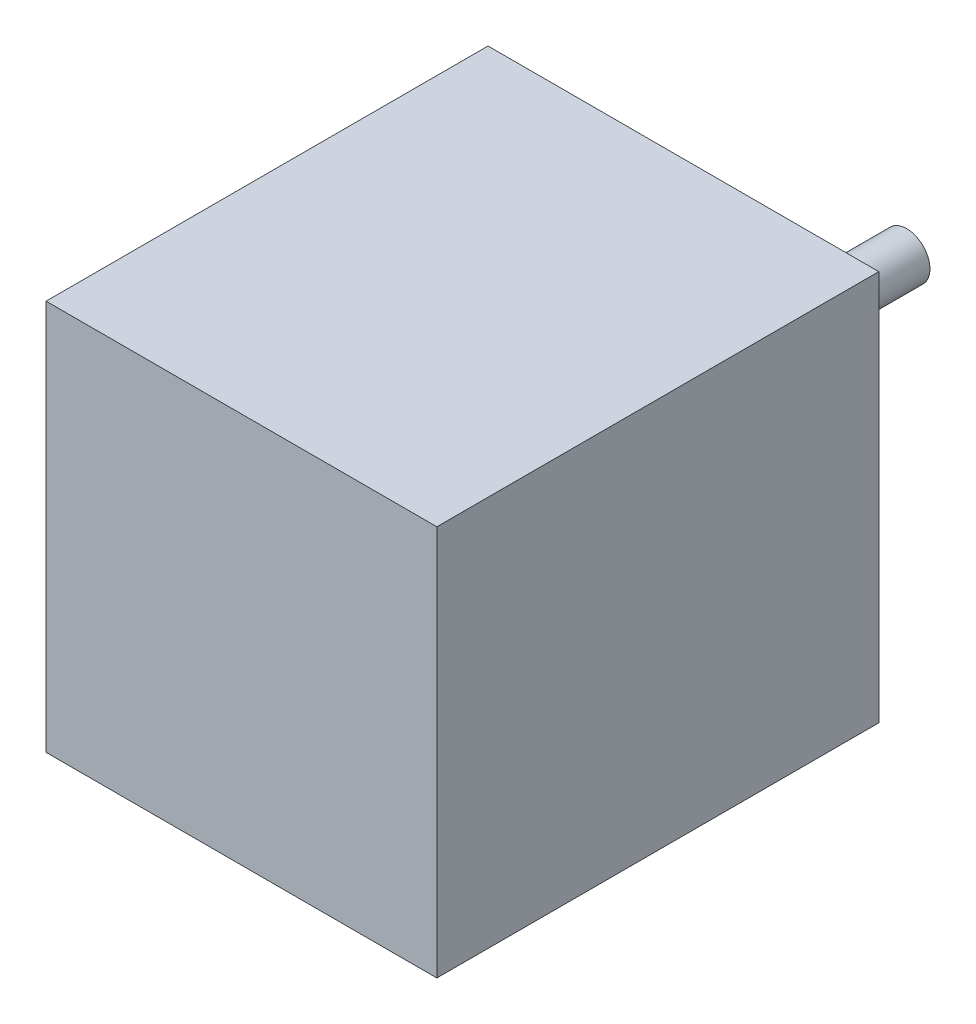
ISO-10303-21;
HEADER;
FILE_DESCRIPTION(('STEP AP214'),'2;1');
FILE_NAME('part.step','',(''),(''),'','','');
FILE_SCHEMA(('AUTOMOTIVE_DESIGN { 1 0 10303 214 1 1 1 1 }'));
ENDSEC;
DATA;
#1=APPLICATION_CONTEXT('core data for automotive mechanical design processes');
#2=APPLICATION_PROTOCOL_DEFINITION('international standard','automotive_design',2000,#1);
#3=PRODUCT_CONTEXT('',#1,'mechanical');
#4=PRODUCT('Part','Part','',(#3));
#5=PRODUCT_RELATED_PRODUCT_CATEGORY('part','',(#4));
#6=PRODUCT_DEFINITION_FORMATION('','',#4);
#7=PRODUCT_DEFINITION_CONTEXT('part definition',#1,'design');
#8=PRODUCT_DEFINITION('design','',#6,#7);
#9=PRODUCT_DEFINITION_SHAPE('','',#8);
#10=(LENGTH_UNIT() NAMED_UNIT(*) SI_UNIT(.MILLI.,.METRE.));
#11=(NAMED_UNIT(*) PLANE_ANGLE_UNIT() SI_UNIT($,.RADIAN.));
#12=(NAMED_UNIT(*) SI_UNIT($,.STERADIAN.) SOLID_ANGLE_UNIT());
#13=UNCERTAINTY_MEASURE_WITH_UNIT(LENGTH_MEASURE(1.E-05),#10,'distance_accuracy_value','');
#14=(GEOMETRIC_REPRESENTATION_CONTEXT(3) GLOBAL_UNCERTAINTY_ASSIGNED_CONTEXT((#13)) GLOBAL_UNIT_ASSIGNED_CONTEXT((#10,
#11,#12)) REPRESENTATION_CONTEXT('',''));
#15=CARTESIAN_POINT('',(0.,0.,0.));
#16=DIRECTION('',(0.,0.,1.));
#17=DIRECTION('',(1.,0.,0.));
#18=AXIS2_PLACEMENT_3D('',#15,#16,#17);
#19=CARTESIAN_POINT('',(0.,0.,47.5));
#20=DIRECTION('',(-1.,0.,0.));
#21=DIRECTION('',(0.,0.,1.));
#22=AXIS2_PLACEMENT_3D('',#19,#20,#21);
#23=PLANE('',#22);
#24=DIRECTION('',(0.,1.,0.));
#25=VECTOR('',#24,1.);
#26=CARTESIAN_POINT('',(0.,0.,0.));
#27=LINE('',#26,#25);
#28=CARTESIAN_POINT('',(0.,0.,0.));
#29=VERTEX_POINT('',#28);
#30=CARTESIAN_POINT('',(0.,42.,0.));
#31=VERTEX_POINT('',#30);
#32=EDGE_CURVE('E101',#29,#31,#27,.T.);
#33=ORIENTED_EDGE('',*,*,#32,.T.);
#34=DIRECTION('',(0.,0.,-1.));
#35=VECTOR('',#34,1.);
#36=CARTESIAN_POINT('',(0.,42.,47.5));
#37=LINE('',#36,#35);
#38=CARTESIAN_POINT('',(0.,42.,47.5));
#39=VERTEX_POINT('',#38);
#40=EDGE_CURVE('E37',#39,#31,#37,.T.);
#41=ORIENTED_EDGE('',*,*,#40,.F.);
#42=DIRECTION('',(0.,1.,0.));
#43=VECTOR('',#42,1.);
#44=CARTESIAN_POINT('',(0.,0.,47.5));
#45=LINE('',#44,#43);
#46=CARTESIAN_POINT('',(0.,0.,47.5));
#47=VERTEX_POINT('',#46);
#48=EDGE_CURVE('E88',#47,#39,#45,.T.);
#49=ORIENTED_EDGE('',*,*,#48,.F.);
#50=DIRECTION('',(0.,0.,-1.));
#51=VECTOR('',#50,1.);
#52=CARTESIAN_POINT('',(0.,0.,47.5));
#53=LINE('',#52,#51);
#54=EDGE_CURVE('E97',#47,#29,#53,.T.);
#55=ORIENTED_EDGE('',*,*,#54,.T.);
#56=EDGE_LOOP('',(#33,#41,#49,#55));
#57=FACE_BOUND('',#56,.T.);
#58=ADVANCED_FACE('F34',(#57),#23,.F.);
#59=CARTESIAN_POINT('',(0.,42.,47.5));
#60=DIRECTION('',(0.,-1.,0.));
#61=DIRECTION('',(1.,0.,0.));
#62=AXIS2_PLACEMENT_3D('',#59,#60,#61);
#63=PLANE('',#62);
#64=DIRECTION('',(-1.,0.,0.));
#65=VECTOR('',#64,1.);
#66=CARTESIAN_POINT('',(0.,42.,0.));
#67=LINE('',#66,#65);
#68=CARTESIAN_POINT('',(-42.,42.,0.));
#69=VERTEX_POINT('',#68);
#70=EDGE_CURVE('E93',#31,#69,#67,.T.);
#71=ORIENTED_EDGE('',*,*,#70,.T.);
#72=DIRECTION('',(0.,0.,-1.));
#73=VECTOR('',#72,1.);
#74=CARTESIAN_POINT('',(-42.,42.,47.5));
#75=LINE('',#74,#73);
#76=CARTESIAN_POINT('',(-42.,42.,47.5));
#77=VERTEX_POINT('',#76);
#78=EDGE_CURVE('E91',#77,#69,#75,.T.);
#79=ORIENTED_EDGE('',*,*,#78,.F.);
#80=DIRECTION('',(-1.,0.,0.));
#81=VECTOR('',#80,1.);
#82=CARTESIAN_POINT('',(0.,42.,47.5));
#83=LINE('',#82,#81);
#84=EDGE_CURVE('E83',#39,#77,#83,.T.);
#85=ORIENTED_EDGE('',*,*,#84,.F.);
#86=ORIENTED_EDGE('',*,*,#40,.T.);
#87=EDGE_LOOP('',(#71,#79,#85,#86));
#88=FACE_BOUND('',#87,.T.);
#89=ADVANCED_FACE('F92',(#88),#63,.F.);
#90=CARTESIAN_POINT('',(-42.,0.,47.5));
#91=DIRECTION('',(1.,0.,0.));
#92=DIRECTION('',(0.,0.,-1.));
#93=AXIS2_PLACEMENT_3D('',#90,#91,#92);
#94=PLANE('',#93);
#95=DIRECTION('',(0.,-1.,0.));
#96=VECTOR('',#95,1.);
#97=CARTESIAN_POINT('',(-42.,0.,0.));
#98=LINE('',#97,#96);
#99=CARTESIAN_POINT('',(-42.,0.,0.));
#100=VERTEX_POINT('',#99);
#101=EDGE_CURVE('E69',#69,#100,#98,.T.);
#102=ORIENTED_EDGE('',*,*,#101,.T.);
#103=DIRECTION('',(0.,0.,-1.));
#104=VECTOR('',#103,1.);
#105=CARTESIAN_POINT('',(-42.,0.,47.5));
#106=LINE('',#105,#104);
#107=CARTESIAN_POINT('',(-42.,0.,47.5));
#108=VERTEX_POINT('',#107);
#109=EDGE_CURVE('E94',#108,#100,#106,.T.);
#110=ORIENTED_EDGE('',*,*,#109,.F.);
#111=DIRECTION('',(0.,-1.,0.));
#112=VECTOR('',#111,1.);
#113=CARTESIAN_POINT('',(-42.,0.,47.5));
#114=LINE('',#113,#112);
#115=EDGE_CURVE('E86',#77,#108,#114,.T.);
#116=ORIENTED_EDGE('',*,*,#115,.F.);
#117=ORIENTED_EDGE('',*,*,#78,.T.);
#118=EDGE_LOOP('',(#102,#110,#116,#117));
#119=FACE_BOUND('',#118,.T.);
#120=ADVANCED_FACE('F95',(#119),#94,.F.);
#121=CARTESIAN_POINT('',(0.,0.,47.5));
#122=DIRECTION('',(0.,1.,0.));
#123=DIRECTION('',(-1.,0.,0.));
#124=AXIS2_PLACEMENT_3D('',#121,#122,#123);
#125=PLANE('',#124);
#126=DIRECTION('',(1.,0.,0.));
#127=VECTOR('',#126,1.);
#128=CARTESIAN_POINT('',(0.,0.,0.));
#129=LINE('',#128,#127);
#130=EDGE_CURVE('E75',#100,#29,#129,.T.);
#131=ORIENTED_EDGE('',*,*,#130,.T.);
#132=ORIENTED_EDGE('',*,*,#54,.F.);
#133=DIRECTION('',(1.,0.,0.));
#134=VECTOR('',#133,1.);
#135=CARTESIAN_POINT('',(0.,0.,47.5));
#136=LINE('',#135,#134);
#137=EDGE_CURVE('E52',#108,#47,#136,.T.);
#138=ORIENTED_EDGE('',*,*,#137,.F.);
#139=ORIENTED_EDGE('',*,*,#109,.T.);
#140=EDGE_LOOP('',(#131,#132,#138,#139));
#141=FACE_BOUND('',#140,.T.);
#142=ADVANCED_FACE('F109',(#141),#125,.F.);
#143=CARTESIAN_POINT('',(0.,0.,47.5));
#144=DIRECTION('',(0.,0.,1.));
#145=DIRECTION('',(1.,0.,0.));
#146=AXIS2_PLACEMENT_3D('',#143,#144,#145);
#147=PLANE('',#146);
#148=ORIENTED_EDGE('',*,*,#48,.T.);
#149=ORIENTED_EDGE('',*,*,#84,.T.);
#150=ORIENTED_EDGE('',*,*,#115,.T.);
#151=ORIENTED_EDGE('',*,*,#137,.T.);
#152=EDGE_LOOP('',(#148,#149,#150,#151));
#153=FACE_BOUND('',#152,.T.);
#154=ADVANCED_FACE('F84',(#153),#147,.T.);
#155=CARTESIAN_POINT('',(0.,0.,0.));
#156=DIRECTION('',(0.,0.,1.));
#157=DIRECTION('',(1.,0.,0.));
#158=AXIS2_PLACEMENT_3D('',#155,#156,#157);
#159=PLANE('',#158);
#160=CARTESIAN_POINT('',(-5.5,36.5,0.));
#161=DIRECTION('',(0.,0.,-1.));
#162=DIRECTION('',(-1.,0.,0.));
#163=AXIS2_PLACEMENT_3D('',#160,#161,#162);
#164=CIRCLE('',#163,1.5);
#165=CARTESIAN_POINT('',(-7.,36.5,0.));
#166=VERTEX_POINT('',#165);
#167=EDGE_CURVE('E129',#166,#166,#164,.T.);
#168=ORIENTED_EDGE('',*,*,#167,.F.);
#169=EDGE_LOOP('',(#168));
#170=FACE_BOUND('',#169,.T.);
#171=CARTESIAN_POINT('',(-36.5,36.5,0.));
#172=DIRECTION('',(0.,0.,-1.));
#173=DIRECTION('',(-1.,0.,0.));
#174=AXIS2_PLACEMENT_3D('',#171,#172,#173);
#175=CIRCLE('',#174,1.5);
#176=CARTESIAN_POINT('',(-38.,36.5,0.));
#177=VERTEX_POINT('',#176);
#178=EDGE_CURVE('E135',#177,#177,#175,.T.);
#179=ORIENTED_EDGE('',*,*,#178,.F.);
#180=EDGE_LOOP('',(#179));
#181=FACE_BOUND('',#180,.T.);
#182=CARTESIAN_POINT('',(-36.5,5.5,0.));
#183=DIRECTION('',(0.,0.,-1.));
#184=DIRECTION('',(-1.,0.,0.));
#185=AXIS2_PLACEMENT_3D('',#182,#183,#184);
#186=CIRCLE('',#185,1.5);
#187=CARTESIAN_POINT('',(-38.,5.5,0.));
#188=VERTEX_POINT('',#187);
#189=EDGE_CURVE('E141',#188,#188,#186,.T.);
#190=ORIENTED_EDGE('',*,*,#189,.F.);
#191=EDGE_LOOP('',(#190));
#192=FACE_BOUND('',#191,.T.);
#193=CARTESIAN_POINT('',(-5.5,5.5,0.));
#194=DIRECTION('',(0.,0.,-1.));
#195=DIRECTION('',(-1.,0.,0.));
#196=AXIS2_PLACEMENT_3D('',#193,#194,#195);
#197=CIRCLE('',#196,1.5);
#198=CARTESIAN_POINT('',(-7.,5.5,0.));
#199=VERTEX_POINT('',#198);
#200=EDGE_CURVE('E123',#199,#199,#197,.T.);
#201=ORIENTED_EDGE('',*,*,#200,.F.);
#202=EDGE_LOOP('',(#201));
#203=FACE_BOUND('',#202,.T.);
#204=CARTESIAN_POINT('',(-21.,21.,0.));
#205=DIRECTION('',(0.,0.,-1.));
#206=DIRECTION('',(-1.,0.,0.));
#207=AXIS2_PLACEMENT_3D('',#204,#205,#206);
#208=CIRCLE('',#207,11.);
#209=CARTESIAN_POINT('',(-32.,21.,0.));
#210=VERTEX_POINT('',#209);
#211=EDGE_CURVE('E43',#210,#210,#208,.T.);
#212=ORIENTED_EDGE('',*,*,#211,.F.);
#213=EDGE_LOOP('',(#212));
#214=FACE_BOUND('',#213,.T.);
#215=ORIENTED_EDGE('',*,*,#32,.F.);
#216=ORIENTED_EDGE('',*,*,#130,.F.);
#217=ORIENTED_EDGE('',*,*,#101,.F.);
#218=ORIENTED_EDGE('',*,*,#70,.F.);
#219=EDGE_LOOP('',(#215,#216,#217,#218));
#220=FACE_BOUND('',#219,.T.);
#221=ADVANCED_FACE('F112',(#170,#181,#192,#203,#214,#220),#159,.F.);
#222=CARTESIAN_POINT('',(-21.,21.,-2.));
#223=DIRECTION('',(0.,0.,1.));
#224=DIRECTION('',(1.,0.,0.));
#225=AXIS2_PLACEMENT_3D('',#222,#223,#224);
#226=CYLINDRICAL_SURFACE('',#225,11.);
#227=CARTESIAN_POINT('',(-21.,21.,-2.));
#228=DIRECTION('',(0.,0.,-1.));
#229=DIRECTION('',(-1.,0.,0.));
#230=AXIS2_PLACEMENT_3D('',#227,#228,#229);
#231=CIRCLE('',#230,11.);
#232=CARTESIAN_POINT('',(-32.,21.,-2.));
#233=VERTEX_POINT('',#232);
#234=EDGE_CURVE('E104',#233,#233,#231,.T.);
#235=ORIENTED_EDGE('',*,*,#234,.F.);
#236=EDGE_LOOP('',(#235));
#237=FACE_BOUND('',#236,.T.);
#238=ORIENTED_EDGE('',*,*,#211,.T.);
#239=EDGE_LOOP('',(#238));
#240=FACE_BOUND('',#239,.T.);
#241=ADVANCED_FACE('F158',(#237,#240),#226,.T.);
#242=CARTESIAN_POINT('',(-21.,21.,-2.));
#243=DIRECTION('',(0.,0.,-1.));
#244=DIRECTION('',(-1.,0.,0.));
#245=AXIS2_PLACEMENT_3D('',#242,#243,#244);
#246=PLANE('',#245);
#247=CARTESIAN_POINT('',(-21.,21.,-2.));
#248=DIRECTION('',(0.,0.,-1.));
#249=DIRECTION('',(-1.,0.,0.));
#250=AXIS2_PLACEMENT_3D('',#247,#248,#249);
#251=CIRCLE('',#250,2.5);
#252=CARTESIAN_POINT('',(-23.5,21.,-2.));
#253=VERTEX_POINT('',#252);
#254=EDGE_CURVE('E11',#253,#253,#251,.T.);
#255=ORIENTED_EDGE('',*,*,#254,.F.);
#256=EDGE_LOOP('',(#255));
#257=FACE_BOUND('',#256,.T.);
#258=ORIENTED_EDGE('',*,*,#234,.T.);
#259=EDGE_LOOP('',(#258));
#260=FACE_BOUND('',#259,.T.);
#261=ADVANCED_FACE('F166',(#257,#260),#246,.T.);
#262=CARTESIAN_POINT('',(-21.,21.,-24.));
#263=DIRECTION('',(0.,0.,1.));
#264=DIRECTION('',(1.,0.,0.));
#265=AXIS2_PLACEMENT_3D('',#262,#263,#264);
#266=CYLINDRICAL_SURFACE('',#265,2.5);
#267=CARTESIAN_POINT('',(-21.,21.,-24.));
#268=DIRECTION('',(0.,0.,-1.));
#269=DIRECTION('',(-1.,0.,0.));
#270=AXIS2_PLACEMENT_3D('',#267,#268,#269);
#271=CIRCLE('',#270,2.5);
#272=CARTESIAN_POINT('',(-23.5,21.,-24.));
#273=VERTEX_POINT('',#272);
#274=EDGE_CURVE('E118',#273,#273,#271,.T.);
#275=ORIENTED_EDGE('',*,*,#274,.F.);
#276=EDGE_LOOP('',(#275));
#277=FACE_BOUND('',#276,.T.);
#278=ORIENTED_EDGE('',*,*,#254,.T.);
#279=EDGE_LOOP('',(#278));
#280=FACE_BOUND('',#279,.T.);
#281=ADVANCED_FACE('F172',(#277,#280),#266,.T.);
#282=CARTESIAN_POINT('',(-21.,21.,-24.));
#283=DIRECTION('',(0.,0.,-1.));
#284=DIRECTION('',(-1.,0.,0.));
#285=AXIS2_PLACEMENT_3D('',#282,#283,#284);
#286=PLANE('',#285);
#287=ORIENTED_EDGE('',*,*,#274,.T.);
#288=EDGE_LOOP('',(#287));
#289=FACE_BOUND('',#288,.T.);
#290=ADVANCED_FACE('F203',(#289),#286,.T.);
#291=CARTESIAN_POINT('',(-5.5,5.5,8.));
#292=DIRECTION('',(0.,0.,-1.));
#293=DIRECTION('',(-1.,0.,0.));
#294=AXIS2_PLACEMENT_3D('',#291,#292,#293);
#295=CYLINDRICAL_SURFACE('',#294,1.5);
#296=CARTESIAN_POINT('',(-5.5,5.5,8.));
#297=DIRECTION('',(0.,0.,-1.));
#298=DIRECTION('',(-1.,0.,0.));
#299=AXIS2_PLACEMENT_3D('',#296,#297,#298);
#300=CIRCLE('',#299,1.5);
#301=CARTESIAN_POINT('',(-7.,5.5,8.));
#302=VERTEX_POINT('',#301);
#303=EDGE_CURVE('E122',#302,#302,#300,.T.);
#304=ORIENTED_EDGE('',*,*,#303,.F.);
#305=EDGE_LOOP('',(#304));
#306=FACE_BOUND('',#305,.T.);
#307=ORIENTED_EDGE('',*,*,#200,.T.);
#308=EDGE_LOOP('',(#307));
#309=FACE_BOUND('',#308,.T.);
#310=ADVANCED_FACE('F208',(#306,#309),#295,.F.);
#311=CARTESIAN_POINT('',(-5.5,5.5,8.));
#312=DIRECTION('',(0.,0.,-1.));
#313=DIRECTION('',(-1.,0.,0.));
#314=AXIS2_PLACEMENT_3D('',#311,#312,#313);
#315=PLANE('',#314);
#316=ORIENTED_EDGE('',*,*,#303,.T.);
#317=EDGE_LOOP('',(#316));
#318=FACE_BOUND('',#317,.T.);
#319=ADVANCED_FACE('F152',(#318),#315,.T.);
#320=CARTESIAN_POINT('',(-36.5,5.5,8.));
#321=DIRECTION('',(0.,0.,-1.));
#322=DIRECTION('',(-1.,0.,0.));
#323=AXIS2_PLACEMENT_3D('',#320,#321,#322);
#324=CYLINDRICAL_SURFACE('',#323,1.5);
#325=CARTESIAN_POINT('',(-36.5,5.5,8.));
#326=DIRECTION('',(0.,0.,-1.));
#327=DIRECTION('',(-1.,0.,0.));
#328=AXIS2_PLACEMENT_3D('',#325,#326,#327);
#329=CIRCLE('',#328,1.5);
#330=CARTESIAN_POINT('',(-38.,5.5,8.));
#331=VERTEX_POINT('',#330);
#332=EDGE_CURVE('E126',#331,#331,#329,.T.);
#333=ORIENTED_EDGE('',*,*,#332,.F.);
#334=EDGE_LOOP('',(#333));
#335=FACE_BOUND('',#334,.T.);
#336=ORIENTED_EDGE('',*,*,#189,.T.);
#337=EDGE_LOOP('',(#336));
#338=FACE_BOUND('',#337,.T.);
#339=ADVANCED_FACE('F149',(#335,#338),#324,.F.);
#340=CARTESIAN_POINT('',(-36.5,5.5,8.));
#341=DIRECTION('',(0.,0.,-1.));
#342=DIRECTION('',(-1.,0.,0.));
#343=AXIS2_PLACEMENT_3D('',#340,#341,#342);
#344=PLANE('',#343);
#345=ORIENTED_EDGE('',*,*,#332,.T.);
#346=EDGE_LOOP('',(#345));
#347=FACE_BOUND('',#346,.T.);
#348=ADVANCED_FACE('F147',(#347),#344,.T.);
#349=CARTESIAN_POINT('',(-36.5,36.5,8.));
#350=DIRECTION('',(0.,0.,-1.));
#351=DIRECTION('',(-1.,0.,0.));
#352=AXIS2_PLACEMENT_3D('',#349,#350,#351);
#353=CYLINDRICAL_SURFACE('',#352,1.5);
#354=CARTESIAN_POINT('',(-36.5,36.5,8.));
#355=DIRECTION('',(0.,0.,-1.));
#356=DIRECTION('',(-1.,0.,0.));
#357=AXIS2_PLACEMENT_3D('',#354,#355,#356);
#358=CIRCLE('',#357,1.5);
#359=CARTESIAN_POINT('',(-38.,36.5,8.));
#360=VERTEX_POINT('',#359);
#361=EDGE_CURVE('E138',#360,#360,#358,.T.);
#362=ORIENTED_EDGE('',*,*,#361,.F.);
#363=EDGE_LOOP('',(#362));
#364=FACE_BOUND('',#363,.T.);
#365=ORIENTED_EDGE('',*,*,#178,.T.);
#366=EDGE_LOOP('',(#365));
#367=FACE_BOUND('',#366,.T.);
#368=ADVANCED_FACE('F237',(#364,#367),#353,.F.);
#369=CARTESIAN_POINT('',(-36.5,36.5,8.));
#370=DIRECTION('',(0.,0.,-1.));
#371=DIRECTION('',(-1.,0.,0.));
#372=AXIS2_PLACEMENT_3D('',#369,#370,#371);
#373=PLANE('',#372);
#374=ORIENTED_EDGE('',*,*,#361,.T.);
#375=EDGE_LOOP('',(#374));
#376=FACE_BOUND('',#375,.T.);
#377=ADVANCED_FACE('F246',(#376),#373,.T.);
#378=CARTESIAN_POINT('',(-5.5,36.5,8.));
#379=DIRECTION('',(0.,0.,-1.));
#380=DIRECTION('',(-1.,0.,0.));
#381=AXIS2_PLACEMENT_3D('',#378,#379,#380);
#382=CYLINDRICAL_SURFACE('',#381,1.5);
#383=CARTESIAN_POINT('',(-5.5,36.5,8.));
#384=DIRECTION('',(0.,0.,-1.));
#385=DIRECTION('',(-1.,0.,0.));
#386=AXIS2_PLACEMENT_3D('',#383,#384,#385);
#387=CIRCLE('',#386,1.5);
#388=CARTESIAN_POINT('',(-7.,36.5,8.));
#389=VERTEX_POINT('',#388);
#390=EDGE_CURVE('E132',#389,#389,#387,.T.);
#391=ORIENTED_EDGE('',*,*,#390,.F.);
#392=EDGE_LOOP('',(#391));
#393=FACE_BOUND('',#392,.T.);
#394=ORIENTED_EDGE('',*,*,#167,.T.);
#395=EDGE_LOOP('',(#394));
#396=FACE_BOUND('',#395,.T.);
#397=ADVANCED_FACE('F256',(#393,#396),#382,.F.);
#398=CARTESIAN_POINT('',(-5.5,36.5,8.));
#399=DIRECTION('',(0.,0.,-1.));
#400=DIRECTION('',(-1.,0.,0.));
#401=AXIS2_PLACEMENT_3D('',#398,#399,#400);
#402=PLANE('',#401);
#403=ORIENTED_EDGE('',*,*,#390,.T.);
#404=EDGE_LOOP('',(#403));
#405=FACE_BOUND('',#404,.T.);
#406=ADVANCED_FACE('F266',(#405),#402,.T.);
#407=CLOSED_SHELL('',(#58,#89,#120,#142,#154,#221,#241,#261,#281,#290,#310,#319,#339,#348,#368,
#377,#397,#406));
#408=MANIFOLD_SOLID_BREP('B2',#407);
#409=ADVANCED_BREP_SHAPE_REPRESENTATION('',(#18,#408),#14);
#410=SHAPE_DEFINITION_REPRESENTATION(#9,#409);
ENDSEC;
END-ISO-10303-21;
